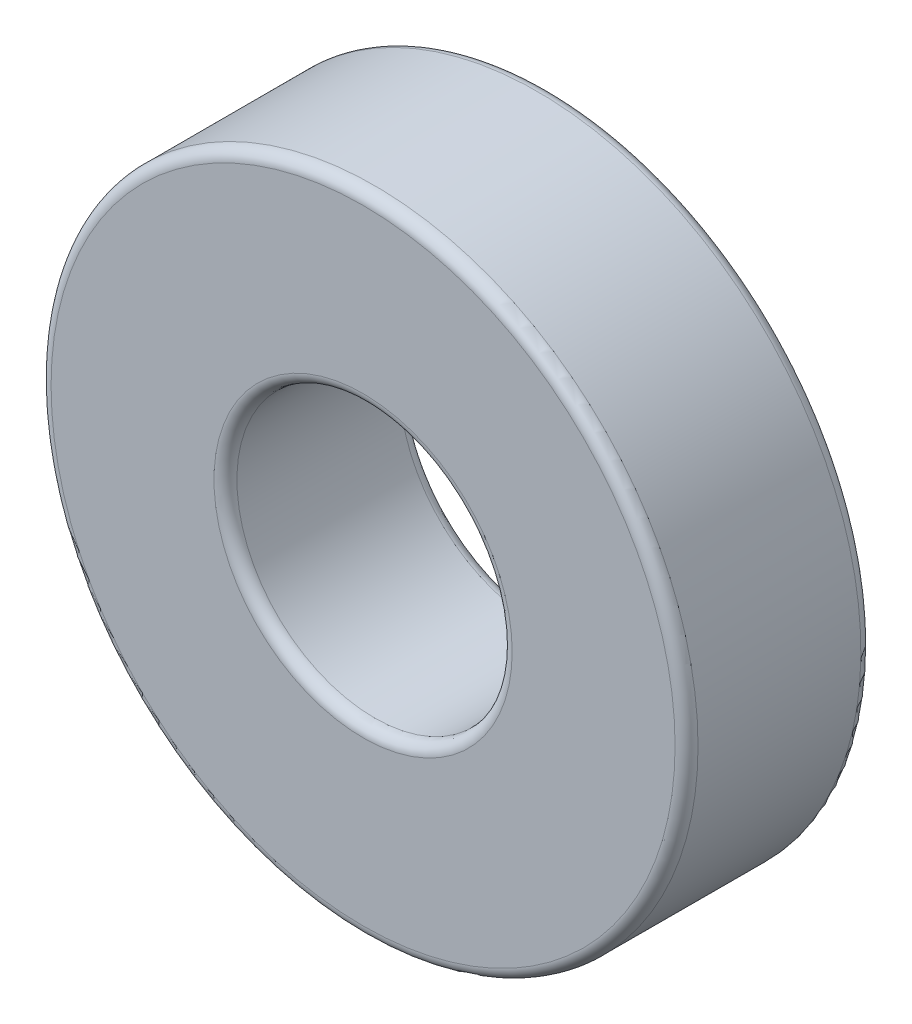
ISO-10303-21;
HEADER;
FILE_DESCRIPTION(('STEP AP214'),'2;1');
FILE_NAME('part.step','',(''),(''),'','','');
FILE_SCHEMA(('AUTOMOTIVE_DESIGN { 1 0 10303 214 1 1 1 1 }'));
ENDSEC;
DATA;
#1=APPLICATION_CONTEXT('core data for automotive mechanical design processes');
#2=APPLICATION_PROTOCOL_DEFINITION('international standard','automotive_design',2000,#1);
#3=PRODUCT_CONTEXT('',#1,'mechanical');
#4=PRODUCT('Part','Part','',(#3));
#5=PRODUCT_RELATED_PRODUCT_CATEGORY('part','',(#4));
#6=PRODUCT_DEFINITION_FORMATION('','',#4);
#7=PRODUCT_DEFINITION_CONTEXT('part definition',#1,'design');
#8=PRODUCT_DEFINITION('design','',#6,#7);
#9=PRODUCT_DEFINITION_SHAPE('','',#8);
#10=(LENGTH_UNIT() NAMED_UNIT(*) SI_UNIT(.MILLI.,.METRE.));
#11=(NAMED_UNIT(*) PLANE_ANGLE_UNIT() SI_UNIT($,.RADIAN.));
#12=(NAMED_UNIT(*) SI_UNIT($,.STERADIAN.) SOLID_ANGLE_UNIT());
#13=UNCERTAINTY_MEASURE_WITH_UNIT(LENGTH_MEASURE(1.E-05),#10,'distance_accuracy_value','');
#14=(GEOMETRIC_REPRESENTATION_CONTEXT(3) GLOBAL_UNCERTAINTY_ASSIGNED_CONTEXT((#13)) GLOBAL_UNIT_ASSIGNED_CONTEXT((#10,
#11,#12)) REPRESENTATION_CONTEXT('',''));
#15=CARTESIAN_POINT('',(0.,0.,0.));
#16=DIRECTION('',(0.,0.,1.));
#17=DIRECTION('',(1.,0.,0.));
#18=AXIS2_PLACEMENT_3D('',#15,#16,#17);
#19=CARTESIAN_POINT('',(1.95949363399733,6.33477656260915E-06,-47.9808224589213));
#20=DIRECTION('',(0.,0.,1.));
#21=DIRECTION('',(-1.,0.,0.));
#22=AXIS2_PLACEMENT_3D('',#19,#20,#21);
#23=CYLINDRICAL_SURFACE('',#22,14.1);
#24=CARTESIAN_POINT('',(1.95949363399733,6.33477656260915E-06,-0.5));
#25=DIRECTION('',(0.,0.,1.));
#26=DIRECTION('',(1.,0.,0.));
#27=AXIS2_PLACEMENT_3D('',#24,#25,#26);
#28=CIRCLE('',#27,14.1);
#29=CARTESIAN_POINT('',(16.0594936339973,6.33477656260915E-06,-0.5));
#30=VERTEX_POINT('',#29);
#31=EDGE_CURVE('E59',#30,#30,#28,.T.);
#32=ORIENTED_EDGE('',*,*,#31,.F.);
#33=EDGE_LOOP('',(#32));
#34=FACE_BOUND('',#33,.T.);
#35=CARTESIAN_POINT('',(1.95949363399733,6.33477656260915E-06,-7.60000000000002));
#36=DIRECTION('',(0.,0.,1.));
#37=DIRECTION('',(0.,-1.,0.));
#38=AXIS2_PLACEMENT_3D('',#35,#36,#37);
#39=CIRCLE('',#38,14.1);
#40=CARTESIAN_POINT('',(1.95949363399733,-14.0999936652234,-7.60000000000002));
#41=VERTEX_POINT('',#40);
#42=EDGE_CURVE('E62',#41,#41,#39,.F.);
#43=ORIENTED_EDGE('',*,*,#42,.F.);
#44=EDGE_LOOP('',(#43));
#45=FACE_BOUND('',#44,.T.);
#46=ADVANCED_FACE('F33',(#34,#45),#23,.T.);
#47=CARTESIAN_POINT('',(1.95949363399733,6.33477656260915E-06,0.));
#48=DIRECTION('',(0.,0.,-1.));
#49=DIRECTION('',(1.,0.,0.));
#50=AXIS2_PLACEMENT_3D('',#47,#48,#49);
#51=PLANE('',#50);
#52=CARTESIAN_POINT('',(1.95949363399733,6.33477656260915E-06,0.));
#53=DIRECTION('',(0.,0.,1.));
#54=DIRECTION('',(1.,0.,0.));
#55=AXIS2_PLACEMENT_3D('',#52,#53,#54);
#56=CIRCLE('',#55,13.6);
#57=CARTESIAN_POINT('',(15.5594936339973,6.33477656260915E-06,0.));
#58=VERTEX_POINT('',#57);
#59=EDGE_CURVE('E53',#58,#58,#56,.F.);
#60=ORIENTED_EDGE('',*,*,#59,.F.);
#61=EDGE_LOOP('',(#60));
#62=FACE_BOUND('',#61,.T.);
#63=CARTESIAN_POINT('',(1.95949363399733,6.33477656260915E-06,0.));
#64=DIRECTION('',(0.,0.,1.));
#65=DIRECTION('',(1.,0.,0.));
#66=AXIS2_PLACEMENT_3D('',#63,#64,#65);
#67=CIRCLE('',#66,6.5);
#68=CARTESIAN_POINT('',(8.45949363399733,6.33477656260915E-06,0.));
#69=VERTEX_POINT('',#68);
#70=EDGE_CURVE('E56',#69,#69,#67,.T.);
#71=ORIENTED_EDGE('',*,*,#70,.F.);
#72=EDGE_LOOP('',(#71));
#73=FACE_BOUND('',#72,.T.);
#74=ADVANCED_FACE('F69',(#62,#73),#51,.F.);
#75=CARTESIAN_POINT('',(1.95949363399733,6.33477656260915E-06,-47.9808224589213));
#76=DIRECTION('',(0.,0.,1.));
#77=DIRECTION('',(-1.,0.,0.));
#78=AXIS2_PLACEMENT_3D('',#75,#76,#77);
#79=CYLINDRICAL_SURFACE('',#78,6.);
#80=CARTESIAN_POINT('',(1.95949363399733,6.33477656260915E-06,-0.5));
#81=DIRECTION('',(0.,0.,1.));
#82=DIRECTION('',(1.,0.,0.));
#83=AXIS2_PLACEMENT_3D('',#80,#81,#82);
#84=CIRCLE('',#83,6.);
#85=CARTESIAN_POINT('',(7.95949363399733,6.33477656260915E-06,-0.5));
#86=VERTEX_POINT('',#85);
#87=EDGE_CURVE('E44',#86,#86,#84,.F.);
#88=ORIENTED_EDGE('',*,*,#87,.F.);
#89=EDGE_LOOP('',(#88));
#90=FACE_BOUND('',#89,.T.);
#91=CARTESIAN_POINT('',(1.95949363399733,6.33477656260915E-06,-7.60000000000002));
#92=DIRECTION('',(0.,0.,1.));
#93=DIRECTION('',(0.,-1.,0.));
#94=AXIS2_PLACEMENT_3D('',#91,#92,#93);
#95=CIRCLE('',#94,6.);
#96=CARTESIAN_POINT('',(1.95949363399733,-5.99999366522343,-7.60000000000002));
#97=VERTEX_POINT('',#96);
#98=EDGE_CURVE('E48',#97,#97,#95,.T.);
#99=ORIENTED_EDGE('',*,*,#98,.F.);
#100=EDGE_LOOP('',(#99));
#101=FACE_BOUND('',#100,.T.);
#102=ADVANCED_FACE('F75',(#90,#101),#79,.F.);
#103=CARTESIAN_POINT('',(1.95949363399731,6.33477664725365E-06,-8.10000000000001));
#104=DIRECTION('',(0.,0.,-1.));
#105=DIRECTION('',(-0.17146403843439,-0.985190379329686,0.));
#106=AXIS2_PLACEMENT_3D('',#103,#104,#105);
#107=PLANE('',#106);
#108=CARTESIAN_POINT('',(1.95949363399733,6.33477656267849E-06,-8.10000000000001));
#109=DIRECTION('',(0.,0.,1.));
#110=DIRECTION('',(0.,-1.,0.));
#111=AXIS2_PLACEMENT_3D('',#108,#109,#110);
#112=CIRCLE('',#111,13.6);
#113=CARTESIAN_POINT('',(1.95949363399733,-13.5999936652234,-8.10000000000002));
#114=VERTEX_POINT('',#113);
#115=EDGE_CURVE('E10',#114,#114,#112,.T.);
#116=ORIENTED_EDGE('',*,*,#115,.F.);
#117=EDGE_LOOP('',(#116));
#118=FACE_BOUND('',#117,.T.);
#119=CARTESIAN_POINT('',(1.95949363399733,6.33477656267849E-06,-8.10000000000001));
#120=DIRECTION('',(0.,0.,1.));
#121=DIRECTION('',(0.,-1.,0.));
#122=AXIS2_PLACEMENT_3D('',#119,#120,#121);
#123=CIRCLE('',#122,6.5);
#124=CARTESIAN_POINT('',(1.95949363399733,-6.49999366522343,-8.10000000000002));
#125=VERTEX_POINT('',#124);
#126=EDGE_CURVE('E40',#125,#125,#123,.F.);
#127=ORIENTED_EDGE('',*,*,#126,.F.);
#128=EDGE_LOOP('',(#127));
#129=FACE_BOUND('',#128,.T.);
#130=ADVANCED_FACE('F85',(#118,#129),#107,.T.);
#131=CARTESIAN_POINT('',(1.95949363399733,6.33477656260915E-06,-0.5));
#132=DIRECTION('',(0.,0.,-1.));
#133=DIRECTION('',(1.,0.,0.));
#134=AXIS2_PLACEMENT_3D('',#131,#132,#133);
#135=TOROIDAL_SURFACE('',#134,13.6,0.5);
#136=ORIENTED_EDGE('',*,*,#59,.T.);
#137=EDGE_LOOP('',(#136));
#138=FACE_BOUND('',#137,.T.);
#139=ORIENTED_EDGE('',*,*,#31,.T.);
#140=EDGE_LOOP('',(#139));
#141=FACE_BOUND('',#140,.T.);
#142=ADVANCED_FACE('F81',(#138,#141),#135,.T.);
#143=CARTESIAN_POINT('',(1.95949363399733,6.33477656260915E-06,-0.5));
#144=DIRECTION('',(0.,0.,-1.));
#145=DIRECTION('',(1.,0.,0.));
#146=AXIS2_PLACEMENT_3D('',#143,#144,#145);
#147=TOROIDAL_SURFACE('',#146,6.5,0.5);
#148=ORIENTED_EDGE('',*,*,#87,.T.);
#149=EDGE_LOOP('',(#148));
#150=FACE_BOUND('',#149,.T.);
#151=ORIENTED_EDGE('',*,*,#70,.T.);
#152=EDGE_LOOP('',(#151));
#153=FACE_BOUND('',#152,.T.);
#154=ADVANCED_FACE('F84',(#150,#153),#147,.T.);
#155=CARTESIAN_POINT('',(1.95949363399733,6.33477656260915E-06,-7.60000000000002));
#156=DIRECTION('',(0.,0.,-1.));
#157=DIRECTION('',(0.,-1.,0.));
#158=AXIS2_PLACEMENT_3D('',#155,#156,#157);
#159=TOROIDAL_SURFACE('',#158,13.6,0.5);
#160=ORIENTED_EDGE('',*,*,#42,.T.);
#161=EDGE_LOOP('',(#160));
#162=FACE_BOUND('',#161,.T.);
#163=ORIENTED_EDGE('',*,*,#115,.T.);
#164=EDGE_LOOP('',(#163));
#165=FACE_BOUND('',#164,.T.);
#166=ADVANCED_FACE('F66',(#162,#165),#159,.T.);
#167=CARTESIAN_POINT('',(1.95949363399733,6.33477656260915E-06,-7.60000000000002));
#168=DIRECTION('',(0.,0.,-1.));
#169=DIRECTION('',(0.,-1.,0.));
#170=AXIS2_PLACEMENT_3D('',#167,#168,#169);
#171=TOROIDAL_SURFACE('',#170,6.5,0.5);
#172=ORIENTED_EDGE('',*,*,#126,.T.);
#173=EDGE_LOOP('',(#172));
#174=FACE_BOUND('',#173,.T.);
#175=ORIENTED_EDGE('',*,*,#98,.T.);
#176=EDGE_LOOP('',(#175));
#177=FACE_BOUND('',#176,.T.);
#178=ADVANCED_FACE('F35',(#174,#177),#171,.T.);
#179=CLOSED_SHELL('',(#46,#74,#102,#130,#142,#154,#166,#178));
#180=MANIFOLD_SOLID_BREP('B2',#179);
#181=ADVANCED_BREP_SHAPE_REPRESENTATION('',(#18,#180),#14);
#182=SHAPE_DEFINITION_REPRESENTATION(#9,#181);
ENDSEC;
END-ISO-10303-21;
